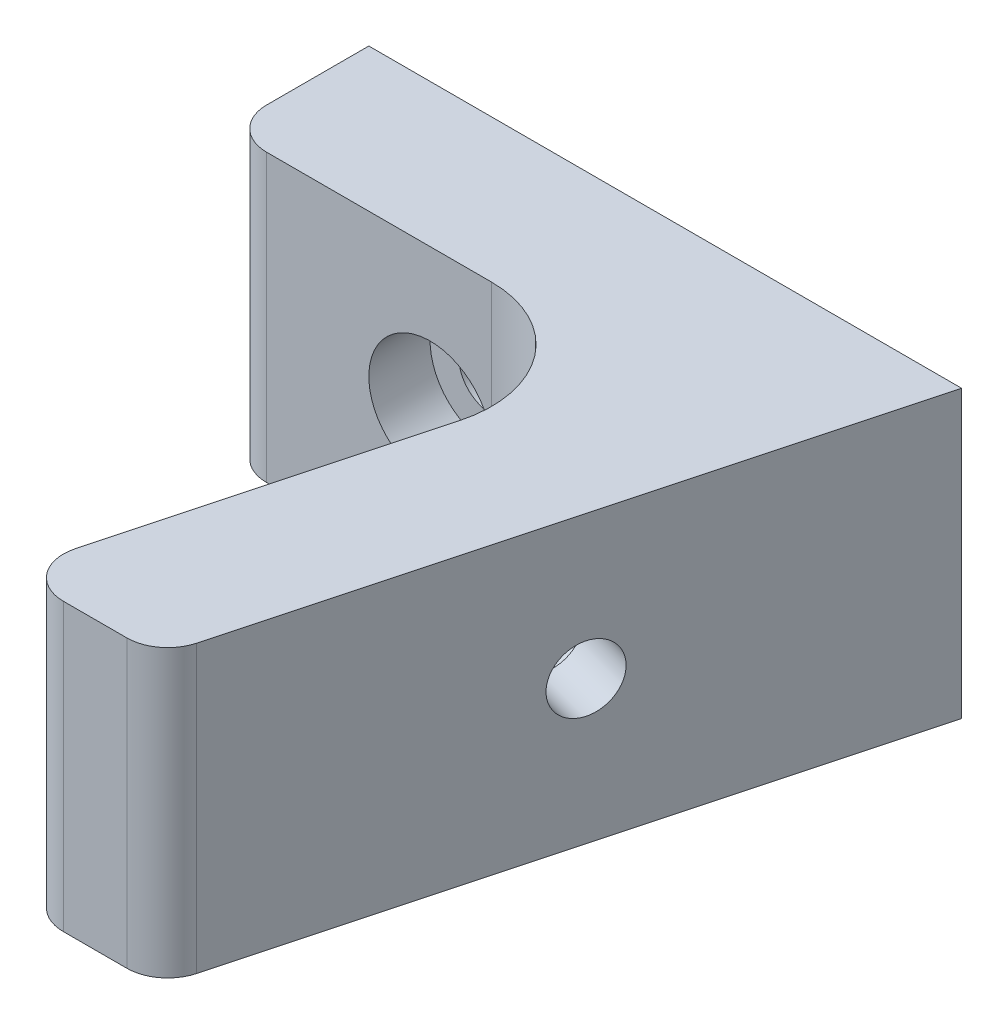
ISO-10303-21;
HEADER;
FILE_DESCRIPTION(('STEP AP214'),'2;1');
FILE_NAME('part.step','',(''),(''),'','','');
FILE_SCHEMA(('AUTOMOTIVE_DESIGN { 1 0 10303 214 1 1 1 1 }'));
ENDSEC;
DATA;
#1=APPLICATION_CONTEXT('core data for automotive mechanical design processes');
#2=APPLICATION_PROTOCOL_DEFINITION('international standard','automotive_design',2000,#1);
#3=PRODUCT_CONTEXT('',#1,'mechanical');
#4=PRODUCT('Part','Part','',(#3));
#5=PRODUCT_RELATED_PRODUCT_CATEGORY('part','',(#4));
#6=PRODUCT_DEFINITION_FORMATION('','',#4);
#7=PRODUCT_DEFINITION_CONTEXT('part definition',#1,'design');
#8=PRODUCT_DEFINITION('design','',#6,#7);
#9=PRODUCT_DEFINITION_SHAPE('','',#8);
#10=(LENGTH_UNIT() NAMED_UNIT(*) SI_UNIT(.MILLI.,.METRE.));
#11=(NAMED_UNIT(*) PLANE_ANGLE_UNIT() SI_UNIT($,.RADIAN.));
#12=(NAMED_UNIT(*) SI_UNIT($,.STERADIAN.) SOLID_ANGLE_UNIT());
#13=UNCERTAINTY_MEASURE_WITH_UNIT(LENGTH_MEASURE(1.E-05),#10,'distance_accuracy_value','');
#14=(GEOMETRIC_REPRESENTATION_CONTEXT(3) GLOBAL_UNCERTAINTY_ASSIGNED_CONTEXT((#13)) GLOBAL_UNIT_ASSIGNED_CONTEXT((#10,
#11,#12)) REPRESENTATION_CONTEXT('',''));
#15=CARTESIAN_POINT('',(0.,0.,0.));
#16=DIRECTION('',(0.,0.,1.));
#17=DIRECTION('',(1.,0.,0.));
#18=AXIS2_PLACEMENT_3D('',#15,#16,#17);
#19=CARTESIAN_POINT('',(-10.,7.,0.));
#20=DIRECTION('',(0.,0.,1.));
#21=DIRECTION('',(1.,0.,0.));
#22=AXIS2_PLACEMENT_3D('',#19,#20,#21);
#23=PLANE('',#22);
#24=CARTESIAN_POINT('',(0.,0.,0.));
#25=DIRECTION('',(0.,0.,1.));
#26=DIRECTION('',(1.,0.,0.));
#27=AXIS2_PLACEMENT_3D('',#24,#25,#26);
#28=CIRCLE('',#27,1.6);
#29=CARTESIAN_POINT('',(1.6,0.,0.));
#30=VERTEX_POINT('',#29);
#31=EDGE_CURVE('E218',#30,#30,#28,.T.);
#32=ORIENTED_EDGE('',*,*,#31,.T.);
#33=EDGE_LOOP('',(#32));
#34=FACE_BOUND('',#33,.T.);
#35=DIRECTION('',(-1.,0.,0.));
#36=VECTOR('',#35,1.);
#37=CARTESIAN_POINT('',(-10.,-7.,0.));
#38=LINE('',#37,#36);
#39=CARTESIAN_POINT('',(19.,-7.,0.));
#40=VERTEX_POINT('',#39);
#41=CARTESIAN_POINT('',(-10.,-7.,0.));
#42=VERTEX_POINT('',#41);
#43=EDGE_CURVE('E221',#40,#42,#38,.T.);
#44=ORIENTED_EDGE('',*,*,#43,.T.);
#45=DIRECTION('',(0.,-1.,0.));
#46=VECTOR('',#45,1.);
#47=CARTESIAN_POINT('',(-10.,7.,0.));
#48=LINE('',#47,#46);
#49=CARTESIAN_POINT('',(-10.,7.,0.));
#50=VERTEX_POINT('',#49);
#51=EDGE_CURVE('E268',#50,#42,#48,.T.);
#52=ORIENTED_EDGE('',*,*,#51,.F.);
#53=DIRECTION('',(-1.,0.,0.));
#54=VECTOR('',#53,1.);
#55=CARTESIAN_POINT('',(-10.,7.,0.));
#56=LINE('',#55,#54);
#57=CARTESIAN_POINT('',(19.,7.,0.));
#58=VERTEX_POINT('',#57);
#59=EDGE_CURVE('E222',#58,#50,#56,.T.);
#60=ORIENTED_EDGE('',*,*,#59,.F.);
#61=DIRECTION('',(0.,-1.,0.));
#62=VECTOR('',#61,1.);
#63=CARTESIAN_POINT('',(19.,7.,0.));
#64=LINE('',#63,#62);
#65=EDGE_CURVE('E240',#58,#40,#64,.T.);
#66=ORIENTED_EDGE('',*,*,#65,.T.);
#67=EDGE_LOOP('',(#44,#52,#60,#66));
#68=FACE_BOUND('',#67,.T.);
#69=ADVANCED_FACE('F33',(#34,#68),#23,.F.);
#70=CARTESIAN_POINT('',(-10.,7.,0.));
#71=DIRECTION('',(1.,0.,0.));
#72=DIRECTION('',(0.,0.,-1.));
#73=AXIS2_PLACEMENT_3D('',#70,#71,#72);
#74=PLANE('',#73);
#75=DIRECTION('',(0.,0.,1.));
#76=VECTOR('',#75,1.);
#77=CARTESIAN_POINT('',(-10.,-7.,0.));
#78=LINE('',#77,#76);
#79=CARTESIAN_POINT('',(-10.,-7.,5.));
#80=VERTEX_POINT('',#79);
#81=EDGE_CURVE('E243',#42,#80,#78,.T.);
#82=ORIENTED_EDGE('',*,*,#81,.T.);
#83=DIRECTION('',(0.,-1.,0.));
#84=VECTOR('',#83,1.);
#85=CARTESIAN_POINT('',(-10.,7.,5.));
#86=LINE('',#85,#84);
#87=CARTESIAN_POINT('',(-10.,7.,5.));
#88=VERTEX_POINT('',#87);
#89=EDGE_CURVE('E280',#80,#88,#86,.F.);
#90=ORIENTED_EDGE('',*,*,#89,.T.);
#91=DIRECTION('',(0.,0.,1.));
#92=VECTOR('',#91,1.);
#93=CARTESIAN_POINT('',(-10.,7.,0.));
#94=LINE('',#93,#92);
#95=EDGE_CURVE('E225',#50,#88,#94,.T.);
#96=ORIENTED_EDGE('',*,*,#95,.F.);
#97=ORIENTED_EDGE('',*,*,#51,.T.);
#98=EDGE_LOOP('',(#82,#90,#96,#97));
#99=FACE_BOUND('',#98,.T.);
#100=ADVANCED_FACE('F352',(#99),#74,.F.);
#101=CARTESIAN_POINT('',(-10.,7.,7.));
#102=DIRECTION('',(0.,0.,-1.));
#103=DIRECTION('',(-1.,0.,0.));
#104=AXIS2_PLACEMENT_3D('',#101,#102,#103);
#105=PLANE('',#104);
#106=DIRECTION('',(1.,0.,0.));
#107=VECTOR('',#106,1.);
#108=CARTESIAN_POINT('',(-10.,7.,7.));
#109=LINE('',#108,#107);
#110=CARTESIAN_POINT('',(-8.,7.,7.));
#111=VERTEX_POINT('',#110);
#112=CARTESIAN_POINT('',(3.,7.,7.));
#113=VERTEX_POINT('',#112);
#114=EDGE_CURVE('E229',#111,#113,#109,.T.);
#115=ORIENTED_EDGE('',*,*,#114,.F.);
#116=DIRECTION('',(0.,-1.,0.));
#117=VECTOR('',#116,1.);
#118=CARTESIAN_POINT('',(-8.,7.,7.));
#119=LINE('',#118,#117);
#120=CARTESIAN_POINT('',(-8.,-7.,7.));
#121=VERTEX_POINT('',#120);
#122=EDGE_CURVE('E271',#111,#121,#119,.T.);
#123=ORIENTED_EDGE('',*,*,#122,.T.);
#124=DIRECTION('',(1.,0.,0.));
#125=VECTOR('',#124,1.);
#126=CARTESIAN_POINT('',(-10.,-7.,7.));
#127=LINE('',#126,#125);
#128=CARTESIAN_POINT('',(3.,-7.,7.));
#129=VERTEX_POINT('',#128);
#130=EDGE_CURVE('E246',#121,#129,#127,.T.);
#131=ORIENTED_EDGE('',*,*,#130,.T.);
#132=DIRECTION('',(0.,-1.,0.));
#133=VECTOR('',#132,1.);
#134=CARTESIAN_POINT('',(3.,7.,7.));
#135=LINE('',#134,#133);
#136=CARTESIAN_POINT('',(3.,0.,7.));
#137=VERTEX_POINT('',#136);
#138=EDGE_CURVE('E264',#137,#129,#135,.T.);
#139=ORIENTED_EDGE('',*,*,#138,.F.);
#140=CARTESIAN_POINT('',(0.,0.,7.));
#141=DIRECTION('',(0.,0.,1.));
#142=DIRECTION('',(1.,0.,0.));
#143=AXIS2_PLACEMENT_3D('',#140,#141,#142);
#144=CIRCLE('',#143,3.);
#145=EDGE_CURVE('E210',#137,#137,#144,.T.);
#146=ORIENTED_EDGE('',*,*,#145,.F.);
#147=EDGE_CURVE('E265',#113,#137,#135,.T.);
#148=ORIENTED_EDGE('',*,*,#147,.F.);
#149=EDGE_LOOP('',(#115,#123,#131,#139,#146,#148));
#150=FACE_BOUND('',#149,.T.);
#151=ADVANCED_FACE('F360',(#150),#105,.F.);
#152=CARTESIAN_POINT('',(3.,7.,12.2772318076633));
#153=DIRECTION('',(0.,-1.,0.));
#154=DIRECTION('',(0.,0.,-1.));
#155=AXIS2_PLACEMENT_3D('',#152,#153,#154);
#156=CYLINDRICAL_SURFACE('',#155,5.27723180766331);
#157=DIRECTION('',(0.,-1.,0.));
#158=VECTOR('',#157,1.);
#159=CARTESIAN_POINT('',(8.09741449433614,7.,13.6430799049074));
#160=LINE('',#159,#158);
#161=CARTESIAN_POINT('',(8.09741449433613,-2.59807621135332,13.6430799049074));
#162=VERTEX_POINT('',#161);
#163=CARTESIAN_POINT('',(8.09741449433614,-7.,13.6430799049074));
#164=VERTEX_POINT('',#163);
#165=EDGE_CURVE('E260',#162,#164,#160,.T.);
#166=ORIENTED_EDGE('',*,*,#165,.F.);
#167=CARTESIAN_POINT('',(3.,-2.59807621135331,12.2772318076633));
#168=DIRECTION('',(-0.129409522551262,-0.866025403784439,0.482962913144534));
#169=DIRECTION('',(0.224143868042017,-0.5,-0.836516303737807));
#170=AXIS2_PLACEMENT_3D('',#167,#168,#169);
#171=ELLIPSE('',#170,6.09362240946094,5.27723180766331);
#172=CARTESIAN_POINT('',(8.26387866764209,-3.17542648054294,12.6524076653034));
#173=VERTEX_POINT('',#172);
#174=EDGE_CURVE('E204',#162,#173,#171,.F.);
#175=ORIENTED_EDGE('',*,*,#174,.T.);
#176=CARTESIAN_POINT('',(3.,-3.75277674973257,12.2772318076633));
#177=DIRECTION('',(0.129409522551262,-0.866025403784439,-0.482962913144533));
#178=DIRECTION('',(-0.224143868042017,-0.5,0.836516303737807));
#179=AXIS2_PLACEMENT_3D('',#176,#177,#178);
#180=ELLIPSE('',#179,6.09362240946094,5.27723180766331);
#181=CARTESIAN_POINT('',(7.55709388619205,-1.58771324027147,9.61601575776348));
#182=VERTEX_POINT('',#181);
#183=EDGE_CURVE('E11',#173,#182,#180,.F.);
#184=ORIENTED_EDGE('',*,*,#183,.T.);
#185=DIRECTION('',(0.,-1.,0.));
#186=VECTOR('',#185,1.);
#187=CARTESIAN_POINT('',(7.55709388619205,7.,9.61601575776348));
#188=LINE('',#187,#186);
#189=CARTESIAN_POINT('',(7.55709388619205,1.58771324027147,9.61601575776348));
#190=VERTEX_POINT('',#189);
#191=EDGE_CURVE('E41',#182,#190,#188,.F.);
#192=ORIENTED_EDGE('',*,*,#191,.T.);
#193=CARTESIAN_POINT('',(3.,3.75277674973257,12.2772318076633));
#194=DIRECTION('',(0.129409522551262,0.866025403784439,-0.482962913144534));
#195=DIRECTION('',(0.224143868042017,-0.5,-0.836516303737807));
#196=AXIS2_PLACEMENT_3D('',#193,#194,#195);
#197=ELLIPSE('',#196,6.09362240946094,5.27723180766331);
#198=CARTESIAN_POINT('',(8.26387866764209,3.17542648054294,12.6524076653034));
#199=VERTEX_POINT('',#198);
#200=EDGE_CURVE('E162',#190,#199,#197,.F.);
#201=ORIENTED_EDGE('',*,*,#200,.T.);
#202=CARTESIAN_POINT('',(3.,2.59807621135332,12.2772318076633));
#203=DIRECTION('',(-0.129409522551262,0.866025403784439,0.482962913144533));
#204=DIRECTION('',(-0.224143868042017,-0.5,0.836516303737807));
#205=AXIS2_PLACEMENT_3D('',#202,#203,#204);
#206=ELLIPSE('',#205,6.09362240946094,5.27723180766331);
#207=CARTESIAN_POINT('',(8.09741449433613,2.59807621135332,13.6430799049074));
#208=VERTEX_POINT('',#207);
#209=EDGE_CURVE('E201',#199,#208,#206,.F.);
#210=ORIENTED_EDGE('',*,*,#209,.T.);
#211=CARTESIAN_POINT('',(8.09741449433614,7.,13.6430799049074));
#212=VERTEX_POINT('',#211);
#213=EDGE_CURVE('E261',#212,#208,#160,.T.);
#214=ORIENTED_EDGE('',*,*,#213,.F.);
#215=CARTESIAN_POINT('',(3.,7.,12.2772318076633));
#216=DIRECTION('',(0.,-1.,0.));
#217=DIRECTION('',(0.,0.,-1.));
#218=AXIS2_PLACEMENT_3D('',#215,#216,#217);
#219=CIRCLE('',#218,5.27723180766331);
#220=EDGE_CURVE('E231',#113,#212,#219,.T.);
#221=ORIENTED_EDGE('',*,*,#220,.F.);
#222=ORIENTED_EDGE('',*,*,#147,.T.);
#223=ORIENTED_EDGE('',*,*,#138,.T.);
#224=CARTESIAN_POINT('',(3.,-7.,12.2772318076633));
#225=DIRECTION('',(0.,-1.,0.));
#226=DIRECTION('',(0.,0.,-1.));
#227=AXIS2_PLACEMENT_3D('',#224,#225,#226);
#228=CIRCLE('',#227,5.27723180766331);
#229=EDGE_CURVE('E248',#129,#164,#228,.T.);
#230=ORIENTED_EDGE('',*,*,#229,.T.);
#231=EDGE_LOOP('',(#166,#175,#184,#192,#201,#210,#214,#221,#222,#223,#230));
#232=FACE_BOUND('',#231,.T.);
#233=ADVANCED_FACE('F310',(#232),#156,.F.);
#234=CARTESIAN_POINT('',(8.09741449433613,7.,13.6430799049074));
#235=DIRECTION('',(0.965925826289067,0.,0.258819045102525));
#236=DIRECTION('',(0.258819045102525,0.,-0.965925826289067));
#237=AXIS2_PLACEMENT_3D('',#234,#235,#236);
#238=PLANE('',#237);
#239=DIRECTION('',(0.,-1.,0.));
#240=VECTOR('',#239,1.);
#241=CARTESIAN_POINT('',(7.64448116540671,7.,15.3334501009133));
#242=LINE('',#241,#240);
#243=CARTESIAN_POINT('',(7.64448116540671,1.58771324027147,15.3334501009133));
#244=VERTEX_POINT('',#243);
#245=CARTESIAN_POINT('',(7.64448116540671,-1.58771324027147,15.3334501009133));
#246=VERTEX_POINT('',#245);
#247=EDGE_CURVE('E302',#244,#246,#242,.T.);
#248=ORIENTED_EDGE('',*,*,#247,.T.);
#249=DIRECTION('',(0.224143868042017,-0.5,-0.836516303737807));
#250=VECTOR('',#249,1.);
#251=CARTESIAN_POINT('',(7.02173953044873,-0.198557158514987,17.6575535225649));
#252=LINE('',#251,#250);
#253=EDGE_CURVE('E305',#246,#162,#252,.T.);
#254=ORIENTED_EDGE('',*,*,#253,.T.);
#255=ORIENTED_EDGE('',*,*,#165,.T.);
#256=DIRECTION('',(-0.258819045102525,0.,0.965925826289067));
#257=VECTOR('',#256,1.);
#258=CARTESIAN_POINT('',(8.09741449433613,-7.,13.6430799049074));
#259=LINE('',#258,#257);
#260=CARTESIAN_POINT('',(4.12124086486876,-7.,28.4823619097949));
#261=VERTEX_POINT('',#260);
#262=EDGE_CURVE('E251',#164,#261,#259,.T.);
#263=ORIENTED_EDGE('',*,*,#262,.T.);
#264=DIRECTION('',(0.,-1.,0.));
#265=VECTOR('',#264,1.);
#266=CARTESIAN_POINT('',(4.12124086486876,7.,28.4823619097949));
#267=LINE('',#266,#265);
#268=CARTESIAN_POINT('',(4.12124086486876,7.,28.4823619097949));
#269=VERTEX_POINT('',#268);
#270=EDGE_CURVE('E292',#261,#269,#267,.F.);
#271=ORIENTED_EDGE('',*,*,#270,.T.);
#272=DIRECTION('',(-0.258819045102525,0.,0.965925826289067));
#273=VECTOR('',#272,1.);
#274=CARTESIAN_POINT('',(8.09741449433613,7.,13.6430799049074));
#275=LINE('',#274,#273);
#276=EDGE_CURVE('E233',#212,#269,#275,.T.);
#277=ORIENTED_EDGE('',*,*,#276,.F.);
#278=ORIENTED_EDGE('',*,*,#213,.T.);
#279=DIRECTION('',(-0.224143868042017,-0.5,0.836516303737807));
#280=VECTOR('',#279,1.);
#281=CARTESIAN_POINT('',(8.59074660674285,3.69855715851499,11.8019393964003));
#282=LINE('',#281,#280);
#283=EDGE_CURVE('E297',#208,#244,#282,.T.);
#284=ORIENTED_EDGE('',*,*,#283,.T.);
#285=EDGE_LOOP('',(#248,#254,#255,#263,#271,#277,#278,#284));
#286=FACE_BOUND('',#285,.T.);
#287=ADVANCED_FACE('F320',(#286),#238,.F.);
#288=CARTESIAN_POINT('',(3.44664177176447,7.,31.));
#289=DIRECTION('',(0.,0.,-1.));
#290=DIRECTION('',(-1.,0.,0.));
#291=AXIS2_PLACEMENT_3D('',#288,#289,#290);
#292=PLANE('',#291);
#293=DIRECTION('',(1.,0.,0.));
#294=VECTOR('',#293,1.);
#295=CARTESIAN_POINT('',(3.44664177176447,7.,31.));
#296=LINE('',#295,#294);
#297=CARTESIAN_POINT('',(6.05309251744689,7.,31.));
#298=VERTEX_POINT('',#297);
#299=CARTESIAN_POINT('',(9.15892105867714,7.,31.));
#300=VERTEX_POINT('',#299);
#301=EDGE_CURVE('E236',#298,#300,#296,.T.);
#302=ORIENTED_EDGE('',*,*,#301,.F.);
#303=DIRECTION('',(0.,-1.,0.));
#304=VECTOR('',#303,1.);
#305=CARTESIAN_POINT('',(6.05309251744689,7.,31.));
#306=LINE('',#305,#304);
#307=CARTESIAN_POINT('',(6.05309251744689,-7.,31.));
#308=VERTEX_POINT('',#307);
#309=EDGE_CURVE('E289',#298,#308,#306,.T.);
#310=ORIENTED_EDGE('',*,*,#309,.T.);
#311=DIRECTION('',(1.,0.,0.));
#312=VECTOR('',#311,1.);
#313=CARTESIAN_POINT('',(3.44664177176447,-7.,31.));
#314=LINE('',#313,#312);
#315=CARTESIAN_POINT('',(9.15892105867714,-7.,31.));
#316=VERTEX_POINT('',#315);
#317=EDGE_CURVE('E254',#308,#316,#314,.T.);
#318=ORIENTED_EDGE('',*,*,#317,.T.);
#319=DIRECTION('',(0.,-1.,0.));
#320=VECTOR('',#319,1.);
#321=CARTESIAN_POINT('',(9.15892105867714,7.,31.));
#322=LINE('',#321,#320);
#323=EDGE_CURVE('E287',#316,#300,#322,.F.);
#324=ORIENTED_EDGE('',*,*,#323,.T.);
#325=EDGE_LOOP('',(#302,#310,#318,#324));
#326=FACE_BOUND('',#325,.T.);
#327=ADVANCED_FACE('F334',(#326),#292,.F.);
#328=CARTESIAN_POINT('',(19.,7.,0.));
#329=DIRECTION('',(-0.965925826289067,0.,-0.258819045102525));
#330=DIRECTION('',(-0.258819045102525,0.,0.965925826289067));
#331=AXIS2_PLACEMENT_3D('',#328,#329,#330);
#332=PLANE('',#331);
#333=CARTESIAN_POINT('',(15.1177143234621,0.,14.488887394336));
#334=DIRECTION('',(0.965925826289067,0.,0.258819045102525));
#335=DIRECTION('',(0.258819045102525,0.,-0.965925826289067));
#336=AXIS2_PLACEMENT_3D('',#333,#334,#335);
#337=CIRCLE('',#336,1.6);
#338=CARTESIAN_POINT('',(15.5318247956262,0.,12.9434060722735));
#339=VERTEX_POINT('',#338);
#340=EDGE_CURVE('E207',#339,#339,#337,.T.);
#341=ORIENTED_EDGE('',*,*,#340,.F.);
#342=EDGE_LOOP('',(#341));
#343=FACE_BOUND('',#342,.T.);
#344=DIRECTION('',(0.258819045102525,0.,-0.965925826289067));
#345=VECTOR('',#344,1.);
#346=CARTESIAN_POINT('',(19.,7.,0.));
#347=LINE('',#346,#345);
#348=CARTESIAN_POINT('',(11.0907727112553,7.,29.517638090205));
#349=VERTEX_POINT('',#348);
#350=EDGE_CURVE('E238',#349,#58,#347,.T.);
#351=ORIENTED_EDGE('',*,*,#350,.F.);
#352=DIRECTION('',(0.,-1.,0.));
#353=VECTOR('',#352,1.);
#354=CARTESIAN_POINT('',(11.0907727112553,7.,29.517638090205));
#355=LINE('',#354,#353);
#356=CARTESIAN_POINT('',(11.0907727112553,-7.,29.517638090205));
#357=VERTEX_POINT('',#356);
#358=EDGE_CURVE('E294',#349,#357,#355,.T.);
#359=ORIENTED_EDGE('',*,*,#358,.T.);
#360=DIRECTION('',(0.258819045102525,0.,-0.965925826289067));
#361=VECTOR('',#360,1.);
#362=CARTESIAN_POINT('',(19.,-7.,0.));
#363=LINE('',#362,#361);
#364=EDGE_CURVE('E226',#357,#40,#363,.T.);
#365=ORIENTED_EDGE('',*,*,#364,.T.);
#366=ORIENTED_EDGE('',*,*,#65,.F.);
#367=EDGE_LOOP('',(#351,#359,#365,#366));
#368=FACE_BOUND('',#367,.T.);
#369=ADVANCED_FACE('F345',(#343,#368),#332,.F.);
#370=CARTESIAN_POINT('',(3.,7.,12.2772318076633));
#371=DIRECTION('',(0.,-1.,0.));
#372=DIRECTION('',(0.,0.,-1.));
#373=AXIS2_PLACEMENT_3D('',#370,#371,#372);
#374=PLANE('',#373);
#375=ORIENTED_EDGE('',*,*,#95,.T.);
#376=CARTESIAN_POINT('',(-8.,7.,5.));
#377=DIRECTION('',(0.,-1.,0.));
#378=DIRECTION('',(0.,0.,-1.));
#379=AXIS2_PLACEMENT_3D('',#376,#377,#378);
#380=CIRCLE('',#379,2.);
#381=EDGE_CURVE('E285',#88,#111,#380,.F.);
#382=ORIENTED_EDGE('',*,*,#381,.T.);
#383=ORIENTED_EDGE('',*,*,#114,.T.);
#384=ORIENTED_EDGE('',*,*,#220,.T.);
#385=ORIENTED_EDGE('',*,*,#276,.T.);
#386=CARTESIAN_POINT('',(6.05309251744689,7.,29.));
#387=DIRECTION('',(0.,-1.,0.));
#388=DIRECTION('',(0.,0.,-1.));
#389=AXIS2_PLACEMENT_3D('',#386,#387,#388);
#390=CIRCLE('',#389,2.);
#391=EDGE_CURVE('E283',#269,#298,#390,.F.);
#392=ORIENTED_EDGE('',*,*,#391,.T.);
#393=ORIENTED_EDGE('',*,*,#301,.T.);
#394=CARTESIAN_POINT('',(9.15892105867714,7.,29.));
#395=DIRECTION('',(0.,-1.,0.));
#396=DIRECTION('',(0.,0.,-1.));
#397=AXIS2_PLACEMENT_3D('',#394,#395,#396);
#398=CIRCLE('',#397,2.);
#399=EDGE_CURVE('E56',#300,#349,#398,.F.);
#400=ORIENTED_EDGE('',*,*,#399,.T.);
#401=ORIENTED_EDGE('',*,*,#350,.T.);
#402=ORIENTED_EDGE('',*,*,#59,.T.);
#403=EDGE_LOOP('',(#375,#382,#383,#384,#385,#392,#393,#400,#401,#402));
#404=FACE_BOUND('',#403,.T.);
#405=ADVANCED_FACE('F327',(#404),#374,.F.);
#406=CARTESIAN_POINT('',(3.,-7.,12.2772318076633));
#407=DIRECTION('',(0.,-1.,0.));
#408=DIRECTION('',(0.,0.,-1.));
#409=AXIS2_PLACEMENT_3D('',#406,#407,#408);
#410=PLANE('',#409);
#411=ORIENTED_EDGE('',*,*,#130,.F.);
#412=CARTESIAN_POINT('',(-8.,-7.,5.));
#413=DIRECTION('',(0.,-1.,0.));
#414=DIRECTION('',(0.,0.,-1.));
#415=AXIS2_PLACEMENT_3D('',#412,#413,#414);
#416=CIRCLE('',#415,2.);
#417=EDGE_CURVE('E278',#121,#80,#416,.T.);
#418=ORIENTED_EDGE('',*,*,#417,.T.);
#419=ORIENTED_EDGE('',*,*,#81,.F.);
#420=ORIENTED_EDGE('',*,*,#43,.F.);
#421=ORIENTED_EDGE('',*,*,#364,.F.);
#422=CARTESIAN_POINT('',(9.15892105867714,-7.,29.));
#423=DIRECTION('',(0.,-1.,0.));
#424=DIRECTION('',(0.,0.,-1.));
#425=AXIS2_PLACEMENT_3D('',#422,#423,#424);
#426=CIRCLE('',#425,2.);
#427=EDGE_CURVE('E274',#357,#316,#426,.T.);
#428=ORIENTED_EDGE('',*,*,#427,.T.);
#429=ORIENTED_EDGE('',*,*,#317,.F.);
#430=CARTESIAN_POINT('',(6.05309251744689,-7.,29.));
#431=DIRECTION('',(0.,-1.,0.));
#432=DIRECTION('',(0.,0.,-1.));
#433=AXIS2_PLACEMENT_3D('',#430,#431,#432);
#434=CIRCLE('',#433,2.);
#435=EDGE_CURVE('E276',#308,#261,#434,.T.);
#436=ORIENTED_EDGE('',*,*,#435,.T.);
#437=ORIENTED_EDGE('',*,*,#262,.F.);
#438=ORIENTED_EDGE('',*,*,#229,.F.);
#439=EDGE_LOOP('',(#411,#418,#419,#420,#421,#428,#429,#436,#437,#438));
#440=FACE_BOUND('',#439,.T.);
#441=ADVANCED_FACE('F338',(#440),#410,.T.);
#442=CARTESIAN_POINT('',(0.,0.,7.));
#443=DIRECTION('',(0.,0.,1.));
#444=DIRECTION('',(1.,0.,0.));
#445=AXIS2_PLACEMENT_3D('',#442,#443,#444);
#446=CYLINDRICAL_SURFACE('',#445,1.6);
#447=ORIENTED_EDGE('',*,*,#31,.F.);
#448=EDGE_LOOP('',(#447));
#449=FACE_BOUND('',#448,.T.);
#450=CARTESIAN_POINT('',(0.,0.,4.));
#451=DIRECTION('',(0.,0.,1.));
#452=DIRECTION('',(1.,0.,0.));
#453=AXIS2_PLACEMENT_3D('',#450,#451,#452);
#454=CIRCLE('',#453,1.6);
#455=CARTESIAN_POINT('',(1.6,0.,4.));
#456=VERTEX_POINT('',#455);
#457=EDGE_CURVE('E215',#456,#456,#454,.T.);
#458=ORIENTED_EDGE('',*,*,#457,.T.);
#459=EDGE_LOOP('',(#458));
#460=FACE_BOUND('',#459,.T.);
#461=ADVANCED_FACE('F408',(#449,#460),#446,.F.);
#462=CARTESIAN_POINT('',(1.6,0.,4.));
#463=DIRECTION('',(0.,0.,-1.));
#464=DIRECTION('',(-1.,0.,0.));
#465=AXIS2_PLACEMENT_3D('',#462,#463,#464);
#466=PLANE('',#465);
#467=ORIENTED_EDGE('',*,*,#457,.F.);
#468=EDGE_LOOP('',(#467));
#469=FACE_BOUND('',#468,.T.);
#470=CARTESIAN_POINT('',(0.,0.,4.));
#471=DIRECTION('',(0.,0.,1.));
#472=DIRECTION('',(1.,0.,0.));
#473=AXIS2_PLACEMENT_3D('',#470,#471,#472);
#474=CIRCLE('',#473,3.);
#475=CARTESIAN_POINT('',(3.,0.,4.));
#476=VERTEX_POINT('',#475);
#477=EDGE_CURVE('E212',#476,#476,#474,.T.);
#478=ORIENTED_EDGE('',*,*,#477,.T.);
#479=EDGE_LOOP('',(#478));
#480=FACE_BOUND('',#479,.T.);
#481=ADVANCED_FACE('F404',(#469,#480),#466,.F.);
#482=CARTESIAN_POINT('',(0.,0.,7.));
#483=DIRECTION('',(0.,0.,1.));
#484=DIRECTION('',(1.,0.,0.));
#485=AXIS2_PLACEMENT_3D('',#482,#483,#484);
#486=CYLINDRICAL_SURFACE('',#485,3.);
#487=ORIENTED_EDGE('',*,*,#477,.F.);
#488=EDGE_LOOP('',(#487));
#489=FACE_BOUND('',#488,.T.);
#490=ORIENTED_EDGE('',*,*,#145,.T.);
#491=EDGE_LOOP('',(#490));
#492=FACE_BOUND('',#491,.T.);
#493=ADVANCED_FACE('F385',(#489,#492),#486,.F.);
#494=CARTESIAN_POINT('',(-8.,7.,5.));
#495=DIRECTION('',(0.,-1.,0.));
#496=DIRECTION('',(0.,0.,-1.));
#497=AXIS2_PLACEMENT_3D('',#494,#495,#496);
#498=CYLINDRICAL_SURFACE('',#497,2.);
#499=ORIENTED_EDGE('',*,*,#381,.F.);
#500=ORIENTED_EDGE('',*,*,#89,.F.);
#501=ORIENTED_EDGE('',*,*,#417,.F.);
#502=ORIENTED_EDGE('',*,*,#122,.F.);
#503=EDGE_LOOP('',(#499,#500,#501,#502));
#504=FACE_BOUND('',#503,.T.);
#505=ADVANCED_FACE('F355',(#504),#498,.T.);
#506=CARTESIAN_POINT('',(6.05309251744689,7.,29.));
#507=DIRECTION('',(0.,-1.,0.));
#508=DIRECTION('',(0.,0.,-1.));
#509=AXIS2_PLACEMENT_3D('',#506,#507,#508);
#510=CYLINDRICAL_SURFACE('',#509,2.);
#511=ORIENTED_EDGE('',*,*,#391,.F.);
#512=ORIENTED_EDGE('',*,*,#270,.F.);
#513=ORIENTED_EDGE('',*,*,#435,.F.);
#514=ORIENTED_EDGE('',*,*,#309,.F.);
#515=EDGE_LOOP('',(#511,#512,#513,#514));
#516=FACE_BOUND('',#515,.T.);
#517=ADVANCED_FACE('F331',(#516),#510,.T.);
#518=CARTESIAN_POINT('',(9.15892105867714,7.,29.));
#519=DIRECTION('',(0.,-1.,0.));
#520=DIRECTION('',(0.,0.,-1.));
#521=AXIS2_PLACEMENT_3D('',#518,#519,#520);
#522=CYLINDRICAL_SURFACE('',#521,2.);
#523=ORIENTED_EDGE('',*,*,#399,.F.);
#524=ORIENTED_EDGE('',*,*,#323,.F.);
#525=ORIENTED_EDGE('',*,*,#427,.F.);
#526=ORIENTED_EDGE('',*,*,#358,.F.);
#527=EDGE_LOOP('',(#523,#524,#525,#526));
#528=FACE_BOUND('',#527,.T.);
#529=ADVANCED_FACE('F35',(#528),#522,.T.);
#530=CARTESIAN_POINT('',(5.45845606057147,0.,11.9006969433108));
#531=DIRECTION('',(0.965925826289067,0.,0.258819045102525));
#532=DIRECTION('',(0.258819045102525,0.,-0.965925826289067));
#533=AXIS2_PLACEMENT_3D('',#530,#531,#532);
#534=CYLINDRICAL_SURFACE('',#533,1.6);
#535=CARTESIAN_POINT('',(12.2199368445949,0.,13.7124302590284));
#536=DIRECTION('',(0.965925826289067,0.,0.258819045102525));
#537=DIRECTION('',(0.258819045102525,0.,-0.965925826289067));
#538=AXIS2_PLACEMENT_3D('',#535,#536,#537);
#539=CIRCLE('',#538,1.6);
#540=CARTESIAN_POINT('',(12.634047316759,0.,12.1669489369659));
#541=VERTEX_POINT('',#540);
#542=EDGE_CURVE('E194',#541,#541,#539,.F.);
#543=ORIENTED_EDGE('',*,*,#542,.T.);
#544=EDGE_LOOP('',(#543));
#545=FACE_BOUND('',#544,.T.);
#546=ORIENTED_EDGE('',*,*,#340,.T.);
#547=EDGE_LOOP('',(#546));
#548=FACE_BOUND('',#547,.T.);
#549=ADVANCED_FACE('F390',(#545,#548),#534,.F.);
#550=CARTESIAN_POINT('',(6.17020843460341,-1.58771324027147,9.24440092101583));
#551=DIRECTION('',(0.258819045102525,0.,-0.965925826289067));
#552=DIRECTION('',(-0.965925826289067,0.,-0.258819045102525));
#553=AXIS2_PLACEMENT_3D('',#550,#551,#552);
#554=PLANE('',#553);
#555=DIRECTION('',(0.965925826289067,0.,0.258819045102525));
#556=VECTOR('',#555,1.);
#557=CARTESIAN_POINT('',(6.17020843460341,-1.58771324027147,9.24440092101583));
#558=LINE('',#557,#556);
#559=CARTESIAN_POINT('',(12.9316892186269,-1.58771324027147,11.0561342367335));
#560=VERTEX_POINT('',#559);
#561=EDGE_CURVE('E182',#182,#560,#558,.T.);
#562=ORIENTED_EDGE('',*,*,#561,.T.);
#563=DIRECTION('',(0.,1.,0.));
#564=VECTOR('',#563,1.);
#565=CARTESIAN_POINT('',(12.9316892186269,-1.58771324027147,11.0561342367335));
#566=LINE('',#565,#564);
#567=CARTESIAN_POINT('',(12.9316892186269,1.58771324027147,11.0561342367335));
#568=VERTEX_POINT('',#567);
#569=EDGE_CURVE('E175',#560,#568,#566,.T.);
#570=ORIENTED_EDGE('',*,*,#569,.T.);
#571=DIRECTION('',(0.965925826289067,0.,0.258819045102525));
#572=VECTOR('',#571,1.);
#573=CARTESIAN_POINT('',(6.17020843460341,1.58771324027147,9.24440092101583));
#574=LINE('',#573,#572);
#575=EDGE_CURVE('E156',#190,#568,#574,.T.);
#576=ORIENTED_EDGE('',*,*,#575,.F.);
#577=ORIENTED_EDGE('',*,*,#191,.F.);
#578=EDGE_LOOP('',(#562,#570,#576,#577));
#579=FACE_BOUND('',#578,.T.);
#580=ADVANCED_FACE('F180',(#579),#554,.F.);
#581=CARTESIAN_POINT('',(5.45845606057147,-3.17542648054294,11.9006969433108));
#582=DIRECTION('',(0.129409522551262,-0.866025403784439,-0.482962913144533));
#583=DIRECTION('',(0.,0.487058473848148,-0.873369362327711));
#584=AXIS2_PLACEMENT_3D('',#581,#582,#583);
#585=PLANE('',#584);
#586=DIRECTION('',(0.965925826289067,0.,0.258819045102525));
#587=VECTOR('',#586,1.);
#588=CARTESIAN_POINT('',(5.45845606057147,-3.17542648054294,11.9006969433108));
#589=LINE('',#588,#587);
#590=CARTESIAN_POINT('',(12.2199368445949,-3.17542648054294,13.7124302590284));
#591=VERTEX_POINT('',#590);
#592=EDGE_CURVE('E195',#173,#591,#589,.T.);
#593=ORIENTED_EDGE('',*,*,#592,.T.);
#594=DIRECTION('',(0.224143868042017,0.5,-0.836516303737807));
#595=VECTOR('',#594,1.);
#596=CARTESIAN_POINT('',(12.2199368445949,-3.17542648054294,13.7124302590284));
#597=LINE('',#596,#595);
#598=EDGE_CURVE('E167',#591,#560,#597,.T.);
#599=ORIENTED_EDGE('',*,*,#598,.T.);
#600=ORIENTED_EDGE('',*,*,#561,.F.);
#601=ORIENTED_EDGE('',*,*,#183,.F.);
#602=EDGE_LOOP('',(#593,#599,#600,#601));
#603=FACE_BOUND('',#602,.T.);
#604=ADVANCED_FACE('F312',(#603),#585,.F.);
#605=CARTESIAN_POINT('',(6.17020843460341,1.58771324027147,9.24440092101583));
#606=DIRECTION('',(0.129409522551262,0.866025403784439,-0.482962913144534));
#607=DIRECTION('',(0.,0.487058473848148,0.873369362327711));
#608=AXIS2_PLACEMENT_3D('',#605,#606,#607);
#609=PLANE('',#608);
#610=ORIENTED_EDGE('',*,*,#575,.T.);
#611=DIRECTION('',(-0.224143868042017,0.5,0.836516303737807));
#612=VECTOR('',#611,1.);
#613=CARTESIAN_POINT('',(12.9316892186269,1.58771324027147,11.0561342367335));
#614=LINE('',#613,#612);
#615=CARTESIAN_POINT('',(12.2199368445949,3.17542648054294,13.7124302590284));
#616=VERTEX_POINT('',#615);
#617=EDGE_CURVE('E160',#568,#616,#614,.T.);
#618=ORIENTED_EDGE('',*,*,#617,.T.);
#619=DIRECTION('',(0.965925826289067,0.,0.258819045102525));
#620=VECTOR('',#619,1.);
#621=CARTESIAN_POINT('',(5.45845606057147,3.17542648054294,11.9006969433108));
#622=LINE('',#621,#620);
#623=EDGE_CURVE('E166',#199,#616,#622,.T.);
#624=ORIENTED_EDGE('',*,*,#623,.F.);
#625=ORIENTED_EDGE('',*,*,#200,.F.);
#626=EDGE_LOOP('',(#610,#618,#624,#625));
#627=FACE_BOUND('',#626,.T.);
#628=ADVANCED_FACE('F158',(#627),#609,.F.);
#629=CARTESIAN_POINT('',(4.74670368653952,-1.58771324027147,14.5569929656057));
#630=DIRECTION('',(-0.129409522551262,-0.866025403784439,0.482962913144534));
#631=DIRECTION('',(0.,-0.487058473848148,-0.873369362327711));
#632=AXIS2_PLACEMENT_3D('',#629,#630,#631);
#633=PLANE('',#632);
#634=ORIENTED_EDGE('',*,*,#253,.F.);
#635=DIRECTION('',(0.965925826289067,0.,0.258819045102525));
#636=VECTOR('',#635,1.);
#637=CARTESIAN_POINT('',(4.74670368653952,-1.58771324027147,14.5569929656057));
#638=LINE('',#637,#636);
#639=CARTESIAN_POINT('',(11.508184470563,-1.58771324027147,16.3687262813234));
#640=VERTEX_POINT('',#639);
#641=EDGE_CURVE('E197',#246,#640,#638,.T.);
#642=ORIENTED_EDGE('',*,*,#641,.T.);
#643=DIRECTION('',(0.224143868042017,-0.5,-0.836516303737807));
#644=VECTOR('',#643,1.);
#645=CARTESIAN_POINT('',(11.508184470563,-1.58771324027147,16.3687262813234));
#646=LINE('',#645,#644);
#647=EDGE_CURVE('E189',#640,#591,#646,.T.);
#648=ORIENTED_EDGE('',*,*,#647,.T.);
#649=ORIENTED_EDGE('',*,*,#592,.F.);
#650=ORIENTED_EDGE('',*,*,#174,.F.);
#651=EDGE_LOOP('',(#634,#642,#648,#649,#650));
#652=FACE_BOUND('',#651,.T.);
#653=ADVANCED_FACE('F365',(#652),#633,.F.);
#654=CARTESIAN_POINT('',(4.74670368653952,1.58771324027147,14.5569929656057));
#655=DIRECTION('',(-0.258819045102525,0.,0.965925826289067));
#656=DIRECTION('',(0.965925826289067,0.,0.258819045102525));
#657=AXIS2_PLACEMENT_3D('',#654,#655,#656);
#658=PLANE('',#657);
#659=DIRECTION('',(0.965925826289067,0.,0.258819045102525));
#660=VECTOR('',#659,1.);
#661=CARTESIAN_POINT('',(4.74670368653952,1.58771324027147,14.5569929656057));
#662=LINE('',#661,#660);
#663=CARTESIAN_POINT('',(11.508184470563,1.58771324027147,16.3687262813234));
#664=VERTEX_POINT('',#663);
#665=EDGE_CURVE('E48',#244,#664,#662,.T.);
#666=ORIENTED_EDGE('',*,*,#665,.T.);
#667=DIRECTION('',(0.,-1.,0.));
#668=VECTOR('',#667,1.);
#669=CARTESIAN_POINT('',(11.508184470563,1.58771324027147,16.3687262813234));
#670=LINE('',#669,#668);
#671=EDGE_CURVE('E186',#664,#640,#670,.T.);
#672=ORIENTED_EDGE('',*,*,#671,.T.);
#673=ORIENTED_EDGE('',*,*,#641,.F.);
#674=ORIENTED_EDGE('',*,*,#247,.F.);
#675=EDGE_LOOP('',(#666,#672,#673,#674));
#676=FACE_BOUND('',#675,.T.);
#677=ADVANCED_FACE('F318',(#676),#658,.F.);
#678=CARTESIAN_POINT('',(5.45845606057147,3.17542648054294,11.9006969433108));
#679=DIRECTION('',(-0.129409522551262,0.866025403784439,0.482962913144533));
#680=DIRECTION('',(0.,-0.487058473848148,0.873369362327711));
#681=AXIS2_PLACEMENT_3D('',#678,#679,#680);
#682=PLANE('',#681);
#683=ORIENTED_EDGE('',*,*,#623,.T.);
#684=DIRECTION('',(-0.224143868042017,-0.5,0.836516303737807));
#685=VECTOR('',#684,1.);
#686=CARTESIAN_POINT('',(12.2199368445949,3.17542648054294,13.7124302590284));
#687=LINE('',#686,#685);
#688=EDGE_CURVE('E178',#616,#664,#687,.T.);
#689=ORIENTED_EDGE('',*,*,#688,.T.);
#690=ORIENTED_EDGE('',*,*,#665,.F.);
#691=ORIENTED_EDGE('',*,*,#283,.F.);
#692=ORIENTED_EDGE('',*,*,#209,.F.);
#693=EDGE_LOOP('',(#683,#689,#690,#691,#692));
#694=FACE_BOUND('',#693,.T.);
#695=ADVANCED_FACE('F323',(#694),#682,.F.);
#696=CARTESIAN_POINT('',(14.8294638570849,0.,3.9735428646925));
#697=DIRECTION('',(0.965925826289067,0.,0.258819045102525));
#698=DIRECTION('',(0.258819045102525,0.,-0.965925826289067));
#699=AXIS2_PLACEMENT_3D('',#696,#697,#698);
#700=PLANE('',#699);
#701=ORIENTED_EDGE('',*,*,#569,.F.);
#702=ORIENTED_EDGE('',*,*,#598,.F.);
#703=ORIENTED_EDGE('',*,*,#647,.F.);
#704=ORIENTED_EDGE('',*,*,#671,.F.);
#705=ORIENTED_EDGE('',*,*,#688,.F.);
#706=ORIENTED_EDGE('',*,*,#617,.F.);
#707=EDGE_LOOP('',(#701,#702,#703,#704,#705,#706));
#708=FACE_BOUND('',#707,.T.);
#709=ORIENTED_EDGE('',*,*,#542,.F.);
#710=EDGE_LOOP('',(#709));
#711=FACE_BOUND('',#710,.T.);
#712=ADVANCED_FACE('F172',(#708,#711),#700,.F.);
#713=CLOSED_SHELL('',(#69,#100,#151,#233,#287,#327,#369,#405,#441,#461,#481,#493,#505,#517,#529,
#549,#580,#604,#628,#653,#677,#695,#712));
#714=MANIFOLD_SOLID_BREP('B2',#713);
#715=ADVANCED_BREP_SHAPE_REPRESENTATION('',(#18,#714),#14);
#716=SHAPE_DEFINITION_REPRESENTATION(#9,#715);
ENDSEC;
END-ISO-10303-21;
